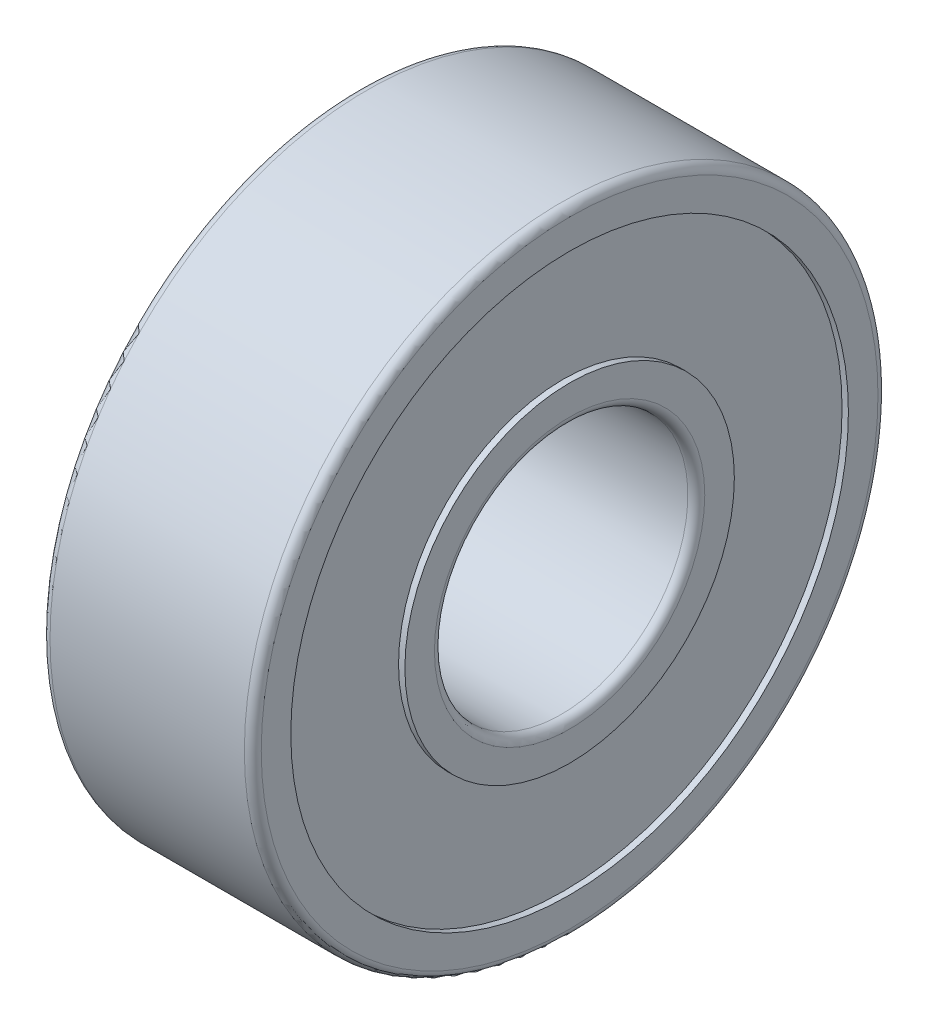
ISO-10303-21;
HEADER;
FILE_DESCRIPTION(('STEP AP214'),'2;1');
FILE_NAME('part.step','',(''),(''),'','','');
FILE_SCHEMA(('AUTOMOTIVE_DESIGN { 1 0 10303 214 1 1 1 1 }'));
ENDSEC;
DATA;
#1=APPLICATION_CONTEXT('core data for automotive mechanical design processes');
#2=APPLICATION_PROTOCOL_DEFINITION('international standard','automotive_design',2000,#1);
#3=PRODUCT_CONTEXT('',#1,'mechanical');
#4=PRODUCT('Part','Part','',(#3));
#5=PRODUCT_RELATED_PRODUCT_CATEGORY('part','',(#4));
#6=PRODUCT_DEFINITION_FORMATION('','',#4);
#7=PRODUCT_DEFINITION_CONTEXT('part definition',#1,'design');
#8=PRODUCT_DEFINITION('design','',#6,#7);
#9=PRODUCT_DEFINITION_SHAPE('','',#8);
#10=(LENGTH_UNIT() NAMED_UNIT(*) SI_UNIT(.MILLI.,.METRE.));
#11=(NAMED_UNIT(*) PLANE_ANGLE_UNIT() SI_UNIT($,.RADIAN.));
#12=(NAMED_UNIT(*) SI_UNIT($,.STERADIAN.) SOLID_ANGLE_UNIT());
#13=UNCERTAINTY_MEASURE_WITH_UNIT(LENGTH_MEASURE(1.E-05),#10,'distance_accuracy_value','');
#14=(GEOMETRIC_REPRESENTATION_CONTEXT(3) GLOBAL_UNCERTAINTY_ASSIGNED_CONTEXT((#13)) GLOBAL_UNIT_ASSIGNED_CONTEXT((#10,
#11,#12)) REPRESENTATION_CONTEXT('',''));
#15=CARTESIAN_POINT('',(0.,0.,0.));
#16=DIRECTION('',(0.,0.,1.));
#17=DIRECTION('',(1.,0.,0.));
#18=AXIS2_PLACEMENT_3D('',#15,#16,#17);
#19=CARTESIAN_POINT('',(0.,0.,0.));
#20=DIRECTION('',(-1.,0.,0.));
#21=DIRECTION('',(0.,0.,1.));
#22=AXIS2_PLACEMENT_3D('',#19,#20,#21);
#23=CYLINDRICAL_SURFACE('',#22,3.);
#24=CARTESIAN_POINT('',(0.2,0.,0.));
#25=DIRECTION('',(1.,0.,0.));
#26=DIRECTION('',(0.,0.,-1.));
#27=AXIS2_PLACEMENT_3D('',#24,#25,#26);
#28=CIRCLE('',#27,3.);
#29=CARTESIAN_POINT('',(0.2,0.,-3.));
#30=VERTEX_POINT('',#29);
#31=EDGE_CURVE('E56',#30,#30,#28,.F.);
#32=ORIENTED_EDGE('',*,*,#31,.T.);
#33=EDGE_LOOP('',(#32));
#34=FACE_BOUND('',#33,.T.);
#35=CARTESIAN_POINT('',(4.8,0.,0.));
#36=DIRECTION('',(-1.,0.,0.));
#37=DIRECTION('',(0.,0.,1.));
#38=AXIS2_PLACEMENT_3D('',#35,#36,#37);
#39=CIRCLE('',#38,3.);
#40=CARTESIAN_POINT('',(4.8,0.,3.));
#41=VERTEX_POINT('',#40);
#42=EDGE_CURVE('E59',#41,#41,#39,.F.);
#43=ORIENTED_EDGE('',*,*,#42,.T.);
#44=EDGE_LOOP('',(#43));
#45=FACE_BOUND('',#44,.T.);
#46=ADVANCED_FACE('F30',(#34,#45),#23,.F.);
#47=CARTESIAN_POINT('',(0.,3.,0.));
#48=DIRECTION('',(1.,0.,0.));
#49=DIRECTION('',(0.,0.,-1.));
#50=AXIS2_PLACEMENT_3D('',#47,#48,#49);
#51=PLANE('',#50);
#52=CARTESIAN_POINT('',(0.,0.,0.));
#53=DIRECTION('',(1.,0.,0.));
#54=DIRECTION('',(0.,0.,-1.));
#55=AXIS2_PLACEMENT_3D('',#52,#53,#54);
#56=CIRCLE('',#55,3.2);
#57=CARTESIAN_POINT('',(0.,0.,-3.2));
#58=VERTEX_POINT('',#57);
#59=EDGE_CURVE('E53',#58,#58,#56,.T.);
#60=ORIENTED_EDGE('',*,*,#59,.T.);
#61=EDGE_LOOP('',(#60));
#62=FACE_BOUND('',#61,.T.);
#63=CARTESIAN_POINT('',(0.,0.,0.));
#64=DIRECTION('',(-1.,0.,0.));
#65=DIRECTION('',(0.,0.,1.));
#66=AXIS2_PLACEMENT_3D('',#63,#64,#65);
#67=CIRCLE('',#66,3.9);
#68=CARTESIAN_POINT('',(0.,0.,3.9));
#69=VERTEX_POINT('',#68);
#70=EDGE_CURVE('E62',#69,#69,#67,.T.);
#71=ORIENTED_EDGE('',*,*,#70,.T.);
#72=EDGE_LOOP('',(#71));
#73=FACE_BOUND('',#72,.T.);
#74=ADVANCED_FACE('F105',(#62,#73),#51,.F.);
#75=CARTESIAN_POINT('',(0.,0.,0.));
#76=DIRECTION('',(-1.,0.,0.));
#77=DIRECTION('',(0.,0.,1.));
#78=AXIS2_PLACEMENT_3D('',#75,#76,#77);
#79=CYLINDRICAL_SURFACE('',#78,3.9);
#80=ORIENTED_EDGE('',*,*,#70,.F.);
#81=EDGE_LOOP('',(#80));
#82=FACE_BOUND('',#81,.T.);
#83=CARTESIAN_POINT('',(0.15,0.,0.));
#84=DIRECTION('',(-1.,0.,0.));
#85=DIRECTION('',(0.,0.,1.));
#86=AXIS2_PLACEMENT_3D('',#83,#84,#85);
#87=CIRCLE('',#86,3.9);
#88=CARTESIAN_POINT('',(0.15,0.,3.9));
#89=VERTEX_POINT('',#88);
#90=EDGE_CURVE('E65',#89,#89,#87,.T.);
#91=ORIENTED_EDGE('',*,*,#90,.T.);
#92=EDGE_LOOP('',(#91));
#93=FACE_BOUND('',#92,.T.);
#94=ADVANCED_FACE('F111',(#82,#93),#79,.T.);
#95=CARTESIAN_POINT('',(0.15,3.9,0.));
#96=DIRECTION('',(1.,0.,0.));
#97=DIRECTION('',(0.,0.,-1.));
#98=AXIS2_PLACEMENT_3D('',#95,#96,#97);
#99=PLANE('',#98);
#100=ORIENTED_EDGE('',*,*,#90,.F.);
#101=EDGE_LOOP('',(#100));
#102=FACE_BOUND('',#101,.T.);
#103=CARTESIAN_POINT('',(0.15,0.,0.));
#104=DIRECTION('',(-1.,0.,0.));
#105=DIRECTION('',(0.,0.,1.));
#106=AXIS2_PLACEMENT_3D('',#103,#104,#105);
#107=CIRCLE('',#106,6.6);
#108=CARTESIAN_POINT('',(0.15,0.,6.6));
#109=VERTEX_POINT('',#108);
#110=EDGE_CURVE('E68',#109,#109,#107,.T.);
#111=ORIENTED_EDGE('',*,*,#110,.T.);
#112=EDGE_LOOP('',(#111));
#113=FACE_BOUND('',#112,.T.);
#114=ADVANCED_FACE('F138',(#102,#113),#99,.F.);
#115=CARTESIAN_POINT('',(0.,0.,0.));
#116=DIRECTION('',(-1.,0.,0.));
#117=DIRECTION('',(0.,0.,1.));
#118=AXIS2_PLACEMENT_3D('',#115,#116,#117);
#119=CYLINDRICAL_SURFACE('',#118,6.6);
#120=ORIENTED_EDGE('',*,*,#110,.F.);
#121=EDGE_LOOP('',(#120));
#122=FACE_BOUND('',#121,.T.);
#123=CARTESIAN_POINT('',(0.,0.,0.));
#124=DIRECTION('',(-1.,0.,0.));
#125=DIRECTION('',(0.,0.,1.));
#126=AXIS2_PLACEMENT_3D('',#123,#124,#125);
#127=CIRCLE('',#126,6.6);
#128=CARTESIAN_POINT('',(0.,0.,6.6));
#129=VERTEX_POINT('',#128);
#130=EDGE_CURVE('E71',#129,#129,#127,.T.);
#131=ORIENTED_EDGE('',*,*,#130,.T.);
#132=EDGE_LOOP('',(#131));
#133=FACE_BOUND('',#132,.T.);
#134=ADVANCED_FACE('F133',(#122,#133),#119,.F.);
#135=CARTESIAN_POINT('',(0.,6.6,0.));
#136=DIRECTION('',(1.,0.,0.));
#137=DIRECTION('',(0.,0.,-1.));
#138=AXIS2_PLACEMENT_3D('',#135,#136,#137);
#139=PLANE('',#138);
#140=CARTESIAN_POINT('',(0.,0.,0.));
#141=DIRECTION('',(1.,0.,0.));
#142=DIRECTION('',(0.,0.,-1.));
#143=AXIS2_PLACEMENT_3D('',#140,#141,#142);
#144=CIRCLE('',#143,7.3);
#145=CARTESIAN_POINT('',(0.,0.,-7.3));
#146=VERTEX_POINT('',#145);
#147=EDGE_CURVE('E45',#146,#146,#144,.F.);
#148=ORIENTED_EDGE('',*,*,#147,.T.);
#149=EDGE_LOOP('',(#148));
#150=FACE_BOUND('',#149,.T.);
#151=ORIENTED_EDGE('',*,*,#130,.F.);
#152=EDGE_LOOP('',(#151));
#153=FACE_BOUND('',#152,.T.);
#154=ADVANCED_FACE('F129',(#150,#153),#139,.F.);
#155=CARTESIAN_POINT('',(0.,0.,0.));
#156=DIRECTION('',(-1.,0.,0.));
#157=DIRECTION('',(0.,0.,1.));
#158=AXIS2_PLACEMENT_3D('',#155,#156,#157);
#159=CYLINDRICAL_SURFACE('',#158,7.5);
#160=CARTESIAN_POINT('',(0.2,0.,0.));
#161=DIRECTION('',(1.,0.,0.));
#162=DIRECTION('',(0.,0.,-1.));
#163=AXIS2_PLACEMENT_3D('',#160,#161,#162);
#164=CIRCLE('',#163,7.5);
#165=CARTESIAN_POINT('',(0.2,0.,-7.5));
#166=VERTEX_POINT('',#165);
#167=EDGE_CURVE('E37',#166,#166,#164,.T.);
#168=ORIENTED_EDGE('',*,*,#167,.T.);
#169=EDGE_LOOP('',(#168));
#170=FACE_BOUND('',#169,.T.);
#171=CARTESIAN_POINT('',(4.8,0.,0.));
#172=DIRECTION('',(-1.,0.,0.));
#173=DIRECTION('',(0.,0.,1.));
#174=AXIS2_PLACEMENT_3D('',#171,#172,#173);
#175=CIRCLE('',#174,7.5);
#176=CARTESIAN_POINT('',(4.8,0.,7.5));
#177=VERTEX_POINT('',#176);
#178=EDGE_CURVE('E41',#177,#177,#175,.T.);
#179=ORIENTED_EDGE('',*,*,#178,.T.);
#180=EDGE_LOOP('',(#179));
#181=FACE_BOUND('',#180,.T.);
#182=ADVANCED_FACE('F132',(#170,#181),#159,.T.);
#183=CARTESIAN_POINT('',(5.,7.5,0.));
#184=DIRECTION('',(-1.,0.,0.));
#185=DIRECTION('',(0.,0.,1.));
#186=AXIS2_PLACEMENT_3D('',#183,#184,#185);
#187=PLANE('',#186);
#188=CARTESIAN_POINT('',(5.,0.,0.));
#189=DIRECTION('',(-1.,0.,0.));
#190=DIRECTION('',(0.,0.,1.));
#191=AXIS2_PLACEMENT_3D('',#188,#189,#190);
#192=CIRCLE('',#191,7.3);
#193=CARTESIAN_POINT('',(5.,0.,7.3));
#194=VERTEX_POINT('',#193);
#195=EDGE_CURVE('E10',#194,#194,#192,.F.);
#196=ORIENTED_EDGE('',*,*,#195,.T.);
#197=EDGE_LOOP('',(#196));
#198=FACE_BOUND('',#197,.T.);
#199=CARTESIAN_POINT('',(5.,0.,0.));
#200=DIRECTION('',(-1.,0.,0.));
#201=DIRECTION('',(0.,0.,1.));
#202=AXIS2_PLACEMENT_3D('',#199,#200,#201);
#203=CIRCLE('',#202,6.6);
#204=CARTESIAN_POINT('',(5.,0.,6.6));
#205=VERTEX_POINT('',#204);
#206=EDGE_CURVE('E74',#205,#205,#203,.T.);
#207=ORIENTED_EDGE('',*,*,#206,.T.);
#208=EDGE_LOOP('',(#207));
#209=FACE_BOUND('',#208,.T.);
#210=ADVANCED_FACE('F178',(#198,#209),#187,.F.);
#211=CARTESIAN_POINT('',(0.,0.,0.));
#212=DIRECTION('',(-1.,0.,0.));
#213=DIRECTION('',(0.,0.,1.));
#214=AXIS2_PLACEMENT_3D('',#211,#212,#213);
#215=CYLINDRICAL_SURFACE('',#214,6.6);
#216=ORIENTED_EDGE('',*,*,#206,.F.);
#217=EDGE_LOOP('',(#216));
#218=FACE_BOUND('',#217,.T.);
#219=CARTESIAN_POINT('',(4.85,0.,0.));
#220=DIRECTION('',(-1.,0.,0.));
#221=DIRECTION('',(0.,0.,1.));
#222=AXIS2_PLACEMENT_3D('',#219,#220,#221);
#223=CIRCLE('',#222,6.6);
#224=CARTESIAN_POINT('',(4.85,0.,6.6));
#225=VERTEX_POINT('',#224);
#226=EDGE_CURVE('E77',#225,#225,#223,.T.);
#227=ORIENTED_EDGE('',*,*,#226,.T.);
#228=EDGE_LOOP('',(#227));
#229=FACE_BOUND('',#228,.T.);
#230=ADVANCED_FACE('F173',(#218,#229),#215,.F.);
#231=CARTESIAN_POINT('',(4.85,6.6,0.));
#232=DIRECTION('',(-1.,0.,0.));
#233=DIRECTION('',(0.,0.,1.));
#234=AXIS2_PLACEMENT_3D('',#231,#232,#233);
#235=PLANE('',#234);
#236=ORIENTED_EDGE('',*,*,#226,.F.);
#237=EDGE_LOOP('',(#236));
#238=FACE_BOUND('',#237,.T.);
#239=CARTESIAN_POINT('',(4.85,0.,0.));
#240=DIRECTION('',(-1.,0.,0.));
#241=DIRECTION('',(0.,0.,1.));
#242=AXIS2_PLACEMENT_3D('',#239,#240,#241);
#243=CIRCLE('',#242,3.9);
#244=CARTESIAN_POINT('',(4.85,0.,3.9));
#245=VERTEX_POINT('',#244);
#246=EDGE_CURVE('E80',#245,#245,#243,.T.);
#247=ORIENTED_EDGE('',*,*,#246,.T.);
#248=EDGE_LOOP('',(#247));
#249=FACE_BOUND('',#248,.T.);
#250=ADVANCED_FACE('F101',(#238,#249),#235,.F.);
#251=CARTESIAN_POINT('',(0.,0.,0.));
#252=DIRECTION('',(-1.,0.,0.));
#253=DIRECTION('',(0.,0.,1.));
#254=AXIS2_PLACEMENT_3D('',#251,#252,#253);
#255=CYLINDRICAL_SURFACE('',#254,3.9);
#256=ORIENTED_EDGE('',*,*,#246,.F.);
#257=EDGE_LOOP('',(#256));
#258=FACE_BOUND('',#257,.T.);
#259=CARTESIAN_POINT('',(5.,0.,0.));
#260=DIRECTION('',(-1.,0.,0.));
#261=DIRECTION('',(0.,0.,1.));
#262=AXIS2_PLACEMENT_3D('',#259,#260,#261);
#263=CIRCLE('',#262,3.9);
#264=CARTESIAN_POINT('',(5.,0.,3.9));
#265=VERTEX_POINT('',#264);
#266=EDGE_CURVE('E83',#265,#265,#263,.T.);
#267=ORIENTED_EDGE('',*,*,#266,.T.);
#268=EDGE_LOOP('',(#267));
#269=FACE_BOUND('',#268,.T.);
#270=ADVANCED_FACE('F87',(#258,#269),#255,.T.);
#271=CARTESIAN_POINT('',(5.,3.9,0.));
#272=DIRECTION('',(-1.,0.,0.));
#273=DIRECTION('',(0.,0.,1.));
#274=AXIS2_PLACEMENT_3D('',#271,#272,#273);
#275=PLANE('',#274);
#276=CARTESIAN_POINT('',(5.,0.,0.));
#277=DIRECTION('',(-1.,0.,0.));
#278=DIRECTION('',(0.,0.,1.));
#279=AXIS2_PLACEMENT_3D('',#276,#277,#278);
#280=CIRCLE('',#279,3.2);
#281=CARTESIAN_POINT('',(5.,0.,3.2));
#282=VERTEX_POINT('',#281);
#283=EDGE_CURVE('E50',#282,#282,#280,.T.);
#284=ORIENTED_EDGE('',*,*,#283,.T.);
#285=EDGE_LOOP('',(#284));
#286=FACE_BOUND('',#285,.T.);
#287=ORIENTED_EDGE('',*,*,#266,.F.);
#288=EDGE_LOOP('',(#287));
#289=FACE_BOUND('',#288,.T.);
#290=ADVANCED_FACE('F89',(#286,#289),#275,.F.);
#291=CARTESIAN_POINT('',(0.2,0.,0.));
#292=DIRECTION('',(1.,0.,0.));
#293=DIRECTION('',(0.,0.,-1.));
#294=AXIS2_PLACEMENT_3D('',#291,#292,#293);
#295=TOROIDAL_SURFACE('',#294,3.2,0.2);
#296=ORIENTED_EDGE('',*,*,#59,.F.);
#297=EDGE_LOOP('',(#296));
#298=FACE_BOUND('',#297,.T.);
#299=ORIENTED_EDGE('',*,*,#31,.F.);
#300=EDGE_LOOP('',(#299));
#301=FACE_BOUND('',#300,.T.);
#302=ADVANCED_FACE('F91',(#298,#301),#295,.T.);
#303=CARTESIAN_POINT('',(4.8,0.,0.));
#304=DIRECTION('',(-1.,0.,0.));
#305=DIRECTION('',(0.,0.,1.));
#306=AXIS2_PLACEMENT_3D('',#303,#304,#305);
#307=TOROIDAL_SURFACE('',#306,3.2,0.2);
#308=ORIENTED_EDGE('',*,*,#42,.F.);
#309=EDGE_LOOP('',(#308));
#310=FACE_BOUND('',#309,.T.);
#311=ORIENTED_EDGE('',*,*,#283,.F.);
#312=EDGE_LOOP('',(#311));
#313=FACE_BOUND('',#312,.T.);
#314=ADVANCED_FACE('F98',(#310,#313),#307,.T.);
#315=CARTESIAN_POINT('',(0.2,0.,0.));
#316=DIRECTION('',(1.,0.,0.));
#317=DIRECTION('',(0.,0.,-1.));
#318=AXIS2_PLACEMENT_3D('',#315,#316,#317);
#319=TOROIDAL_SURFACE('',#318,7.3,0.2);
#320=ORIENTED_EDGE('',*,*,#167,.F.);
#321=EDGE_LOOP('',(#320));
#322=FACE_BOUND('',#321,.T.);
#323=ORIENTED_EDGE('',*,*,#147,.F.);
#324=EDGE_LOOP('',(#323));
#325=FACE_BOUND('',#324,.T.);
#326=ADVANCED_FACE('F118',(#322,#325),#319,.T.);
#327=CARTESIAN_POINT('',(4.8,0.,0.));
#328=DIRECTION('',(-1.,0.,0.));
#329=DIRECTION('',(0.,0.,1.));
#330=AXIS2_PLACEMENT_3D('',#327,#328,#329);
#331=TOROIDAL_SURFACE('',#330,7.3,0.2);
#332=ORIENTED_EDGE('',*,*,#195,.F.);
#333=EDGE_LOOP('',(#332));
#334=FACE_BOUND('',#333,.T.);
#335=ORIENTED_EDGE('',*,*,#178,.F.);
#336=EDGE_LOOP('',(#335));
#337=FACE_BOUND('',#336,.T.);
#338=ADVANCED_FACE('F32',(#334,#337),#331,.T.);
#339=CLOSED_SHELL('',(#46,#74,#94,#114,#134,#154,#182,#210,#230,#250,#270,#290,#302,#314,#326,#338));
#340=MANIFOLD_SOLID_BREP('B2',#339);
#341=ADVANCED_BREP_SHAPE_REPRESENTATION('',(#18,#340),#14);
#342=SHAPE_DEFINITION_REPRESENTATION(#9,#341);
ENDSEC;
END-ISO-10303-21;
